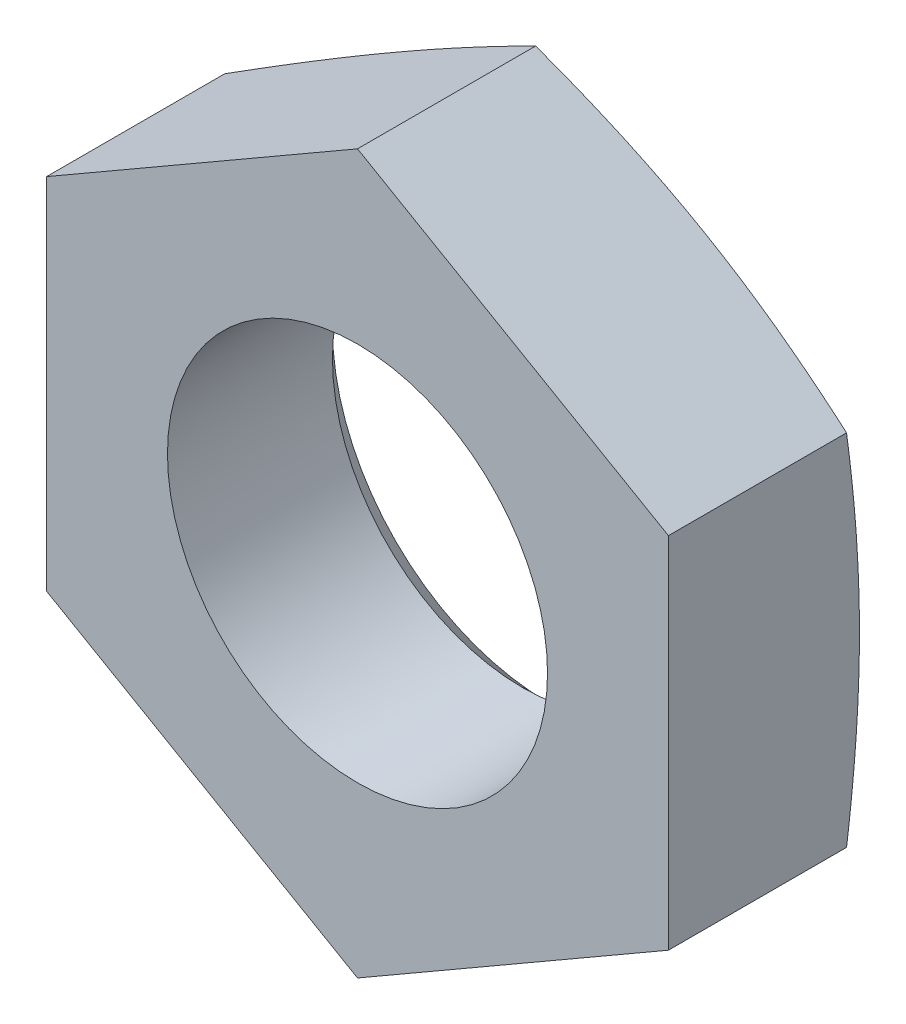
ISO-10303-21;
HEADER;
FILE_DESCRIPTION(('STEP AP214'),'2;1');
FILE_NAME('part.step','',(''),(''),'','','');
FILE_SCHEMA(('AUTOMOTIVE_DESIGN { 1 0 10303 214 1 1 1 1 }'));
ENDSEC;
DATA;
#1=APPLICATION_CONTEXT('core data for automotive mechanical design processes');
#2=APPLICATION_PROTOCOL_DEFINITION('international standard','automotive_design',2000,#1);
#3=PRODUCT_CONTEXT('',#1,'mechanical');
#4=PRODUCT('Part','Part','',(#3));
#5=PRODUCT_RELATED_PRODUCT_CATEGORY('part','',(#4));
#6=PRODUCT_DEFINITION_FORMATION('','',#4);
#7=PRODUCT_DEFINITION_CONTEXT('part definition',#1,'design');
#8=PRODUCT_DEFINITION('design','',#6,#7);
#9=PRODUCT_DEFINITION_SHAPE('','',#8);
#10=(LENGTH_UNIT() NAMED_UNIT(*) SI_UNIT(.MILLI.,.METRE.));
#11=(NAMED_UNIT(*) PLANE_ANGLE_UNIT() SI_UNIT($,.RADIAN.));
#12=(NAMED_UNIT(*) SI_UNIT($,.STERADIAN.) SOLID_ANGLE_UNIT());
#13=UNCERTAINTY_MEASURE_WITH_UNIT(LENGTH_MEASURE(1.E-05),#10,'distance_accuracy_value','');
#14=(GEOMETRIC_REPRESENTATION_CONTEXT(3) GLOBAL_UNCERTAINTY_ASSIGNED_CONTEXT((#13)) GLOBAL_UNIT_ASSIGNED_CONTEXT((#10,
#11,#12)) REPRESENTATION_CONTEXT('',''));
#15=CARTESIAN_POINT('',(0.,0.,0.));
#16=DIRECTION('',(0.,0.,1.));
#17=DIRECTION('',(1.,0.,0.));
#18=AXIS2_PLACEMENT_3D('',#15,#16,#17);
#19=CARTESIAN_POINT('',(7.084,7.,0.));
#20=DIRECTION('',(0.,0.,-1.));
#21=DIRECTION('',(0.,1.,0.));
#22=AXIS2_PLACEMENT_3D('',#19,#20,#21);
#23=PLANE('',#22);
#24=CARTESIAN_POINT('',(0.,0.,0.));
#25=DIRECTION('',(0.,0.,1.));
#26=DIRECTION('',(1.,0.,0.));
#27=AXIS2_PLACEMENT_3D('',#24,#25,#26);
#28=CIRCLE('',#27,7.00000000000497);
#29=CARTESIAN_POINT('',(-3.50000000000122,-6.06217782649318,-6.76896280777531E-13));
#30=VERTEX_POINT('',#29);
#31=CARTESIAN_POINT('',(3.50000000000125,-6.06217782649319,-6.78176082030694E-13));
#32=VERTEX_POINT('',#31);
#33=EDGE_CURVE('E91',#30,#32,#28,.T.);
#34=ORIENTED_EDGE('',*,*,#33,.F.);
#35=CARTESIAN_POINT('',(0.,0.,0.));
#36=DIRECTION('',(0.,0.,1.));
#37=DIRECTION('',(1.,0.,0.));
#38=AXIS2_PLACEMENT_3D('',#35,#36,#37);
#39=CIRCLE('',#38,7.00000000000497);
#40=CARTESIAN_POINT('',(-7.00000000000247,0.,-1.42106649798218E-11));
#41=VERTEX_POINT('',#40);
#42=EDGE_CURVE('E85',#41,#30,#39,.T.);
#43=ORIENTED_EDGE('',*,*,#42,.F.);
#44=CARTESIAN_POINT('',(0.,0.,-2.8421275749535E-11));
#45=DIRECTION('',(0.,0.,1.));
#46=DIRECTION('',(1.,0.,0.));
#47=AXIS2_PLACEMENT_3D('',#44,#45,#46);
#48=CIRCLE('',#47,6.99999999994813);
#49=CARTESIAN_POINT('',(-3.49999999998703,6.06217782646863,-1.319034942035E-11));
#50=VERTEX_POINT('',#49);
#51=EDGE_CURVE('E88',#50,#41,#48,.T.);
#52=ORIENTED_EDGE('',*,*,#51,.F.);
#53=CARTESIAN_POINT('',(0.,0.,2.04057690883497E-12));
#54=DIRECTION('',(0.,0.,1.));
#55=DIRECTION('',(1.,0.,0.));
#56=AXIS2_PLACEMENT_3D('',#53,#54,#55);
#57=CIRCLE('',#56,7.00000000006182);
#58=CARTESIAN_POINT('',(3.50000000001548,6.06217782651788,-6.23222509731635E-12));
#59=VERTEX_POINT('',#58);
#60=EDGE_CURVE('E106',#59,#50,#57,.T.);
#61=ORIENTED_EDGE('',*,*,#60,.F.);
#62=CARTESIAN_POINT('',(0.,0.,0.));
#63=DIRECTION('',(0.,0.,1.));
#64=DIRECTION('',(1.,0.,0.));
#65=AXIS2_PLACEMENT_3D('',#62,#63,#64);
#66=CIRCLE('',#65,7.00000000000497);
#67=CARTESIAN_POINT('',(7.00000000000253,0.,-6.63822162753343E-13));
#68=VERTEX_POINT('',#67);
#69=EDGE_CURVE('E294',#68,#59,#66,.T.);
#70=ORIENTED_EDGE('',*,*,#69,.F.);
#71=CARTESIAN_POINT('',(0.,0.,0.));
#72=DIRECTION('',(0.,0.,1.));
#73=DIRECTION('',(1.,0.,0.));
#74=AXIS2_PLACEMENT_3D('',#71,#72,#73);
#75=CIRCLE('',#74,7.00000000000498);
#76=EDGE_CURVE('E295',#32,#68,#75,.T.);
#77=ORIENTED_EDGE('',*,*,#76,.F.);
#78=EDGE_LOOP('',(#34,#43,#52,#61,#70,#77));
#79=FACE_BOUND('',#78,.T.);
#80=CARTESIAN_POINT('',(0.,0.,0.));
#81=DIRECTION('',(0.,0.,-1.));
#82=DIRECTION('',(0.,1.,0.));
#83=AXIS2_PLACEMENT_3D('',#80,#81,#82);
#84=CIRCLE('',#83,4.86400000005463);
#85=CARTESIAN_POINT('',(0.,4.86400000005463,0.));
#86=VERTEX_POINT('',#85);
#87=EDGE_CURVE('E20',#86,#86,#84,.F.);
#88=ORIENTED_EDGE('',*,*,#87,.T.);
#89=EDGE_LOOP('',(#88));
#90=FACE_BOUND('',#89,.T.);
#91=ADVANCED_FACE('F17',(#79,#90),#23,.T.);
#92=CARTESIAN_POINT('',(0.,0.,0.));
#93=DIRECTION('',(0.,0.,-1.));
#94=DIRECTION('',(0.,1.,0.));
#95=AXIS2_PLACEMENT_3D('',#92,#93,#94);
#96=CONICAL_SURFACE('',#95,4.86400000005463,0.785398163397448);
#97=ORIENTED_EDGE('',*,*,#87,.F.);
#98=EDGE_LOOP('',(#97));
#99=FACE_BOUND('',#98,.T.);
#100=CARTESIAN_POINT('',(0.,0.,0.585999999999948));
#101=DIRECTION('',(0.,0.,1.));
#102=DIRECTION('',(1.,0.,0.));
#103=AXIS2_PLACEMENT_3D('',#100,#101,#102);
#104=CIRCLE('',#103,4.278);
#105=CARTESIAN_POINT('',(4.27800000000003,0.,0.585999999999948));
#106=VERTEX_POINT('',#105);
#107=EDGE_CURVE('E105',#106,#106,#104,.T.);
#108=ORIENTED_EDGE('',*,*,#107,.T.);
#109=EDGE_LOOP('',(#108));
#110=FACE_BOUND('',#109,.T.);
#111=ADVANCED_FACE('F323',(#99,#110),#96,.F.);
#112=CARTESIAN_POINT('',(0.,0.,0.291904169415602));
#113=DIRECTION('',(0.,0.,1.));
#114=DIRECTION('',(1.,0.,0.));
#115=AXIS2_PLACEMENT_3D('',#112,#113,#114);
#116=CONICAL_SURFACE('',#115,8.08940119128462,1.30899693901397);
#117=ORIENTED_EDGE('',*,*,#42,.T.);
#118=CARTESIAN_POINT('',(-6.99999999999925,-4.04145188432135,0.290163190273905));
#119=CARTESIAN_POINT('',(-6.70986023602482,-4.20896415515875,0.24525752563378));
#120=CARTESIAN_POINT('',(-6.41918384251533,-4.37678624920017,0.204486802287307));
#121=CARTESIAN_POINT('',(-5.83725542971782,-4.71276277497907,0.132888648694165));
#122=CARTESIAN_POINT('',(-5.54600444171958,-4.88091661130112,0.102049957460541));
#123=CARTESIAN_POINT('',(-5.10853316460415,-5.13349077090628,0.0644187600860657));
#124=CARTESIAN_POINT('',(-4.96258995261945,-5.21775112363209,0.0533118905781642));
#125=CARTESIAN_POINT('',(-4.67055324940358,-5.38635859284705,0.0341360076685796));
#126=CARTESIAN_POINT('',(-4.52445975870355,-5.47070570902955,0.0260669835668494));
#127=CARTESIAN_POINT('',(-4.2320017165008,-5.63955643842197,0.0130936275290932));
#128=CARTESIAN_POINT('',(-4.0856370451716,-5.72406012081374,0.00819287797152043));
#129=CARTESIAN_POINT('',(-3.79284864328292,-5.89310158345978,0.00164120011324006));
#130=CARTESIAN_POINT('',(-3.6464249109748,-5.97763936472361,-9.62362470803385E-06));
#131=CARTESIAN_POINT('',(-3.49999999999995,-6.06217782649099,-1.35376441792632E-12));
#132=B_SPLINE_CURVE_WITH_KNOTS('',3,(#118,#119,#120,#121,#122,#123,#124,#125,#126,#127,#128,
#129,#130,#131),.UNSPECIFIED.,.F.,.F.,(4,2,2,2,2,2,4),(0.,1.01414051803007,2.02712711718516,
2.53376123183741,3.0403935619816,3.54759774566711,4.05481824781813),.UNSPECIFIED.);
#133=CARTESIAN_POINT('',(-7.00000000000125,-4.04145188432805,0.29016319026956));
#134=VERTEX_POINT('',#133);
#135=EDGE_CURVE('E111',#134,#30,#132,.T.);
#136=ORIENTED_EDGE('',*,*,#135,.F.);
#137=CARTESIAN_POINT('',(-7.,0.,-1.32923867054119E-12));
#138=CARTESIAN_POINT('',(-7.,-0.169076923534791,-9.62362468090186E-06));
#139=CARTESIAN_POINT('',(-7.,-0.338152486062438,0.00164120011326512));
#140=CARTESIAN_POINT('',(-7.,-0.676235411354457,0.00819287797154053));
#141=CARTESIAN_POINT('',(-7.,-0.845242776137971,0.0130936275291105));
#142=CARTESIAN_POINT('',(-7.,-1.18294423492279,0.0260669835668693));
#143=CARTESIAN_POINT('',(-7.,-1.3516384672878,0.0341360076686051));
#144=CARTESIAN_POINT('',(-7.,-1.68885340571766,0.0533118905781666));
#145=CARTESIAN_POINT('',(-7.,-1.85737411116921,0.0644187600860394));
#146=CARTESIAN_POINT('',(-7.,-2.36252243037968,0.102049957460616));
#147=CARTESIAN_POINT('',(-7.,-2.69883010302441,0.132888648694557));
#148=CARTESIAN_POINT('',(-7.,-3.37078315458043,0.204486802286878));
#149=CARTESIAN_POINT('',(-7.,-3.70642734266086,0.24525752563221));
#150=CARTESIAN_POINT('',(-7.,-4.0414518843297,0.290163190269488));
#151=B_SPLINE_CURVE_WITH_KNOTS('',3,(#137,#138,#139,#140,#141,#142,#143,#144,#145,#146,#147,
#148,#149,#150),.UNSPECIFIED.,.F.,.F.,(4,2,2,2,2,2,4),(0.,0.507220502150942,1.0144246858364,
1.52105701598055,2.02769113063276,3.04067772978769,4.05481824781752),.UNSPECIFIED.);
#152=EDGE_CURVE('E108',#41,#134,#151,.T.);
#153=ORIENTED_EDGE('',*,*,#152,.F.);
#154=EDGE_LOOP('',(#117,#136,#153));
#155=FACE_BOUND('',#154,.T.);
#156=ADVANCED_FACE('F109',(#155),#116,.T.);
#157=CARTESIAN_POINT('',(0.,0.,0.291904169415602));
#158=DIRECTION('',(0.,0.,1.));
#159=DIRECTION('',(1.,0.,0.));
#160=AXIS2_PLACEMENT_3D('',#157,#158,#159);
#161=CONICAL_SURFACE('',#160,8.08940119128462,1.30899693901397);
#162=CARTESIAN_POINT('',(-4.82260511685675E-12,-8.08290376865109,0.290163190273904));
#163=CARTESIAN_POINT('',(0.290139763973197,-7.91539149781991,0.245257525633773));
#164=CARTESIAN_POINT('',(0.580816157484114,-7.74756940378096,0.204486802287298));
#165=CARTESIAN_POINT('',(1.16274457028263,-7.41159287800381,0.132888648694156));
#166=CARTESIAN_POINT('',(1.45399555828047,-7.24343904168104,0.102049957460532));
#167=CARTESIAN_POINT('',(1.89146683539575,-6.99086488207564,0.0644187600860573));
#168=CARTESIAN_POINT('',(2.03741004738049,-6.90660452934989,0.0533118905781559));
#169=CARTESIAN_POINT('',(2.32944675059638,-6.73799706013497,0.0341360076685715));
#170=CARTESIAN_POINT('',(2.4755402412964,-6.65364994395245,0.0260669835668414));
#171=CARTESIAN_POINT('',(2.76799828349915,-6.48479921456002,0.0130936275290853));
#172=CARTESIAN_POINT('',(2.91436295482835,-6.40029553216825,0.00819287797151239));
#173=CARTESIAN_POINT('',(3.20715135671704,-6.23125406952222,0.00164120011323326));
#174=CARTESIAN_POINT('',(3.35357508902515,-6.14671628825839,-9.62362471351317E-06));
#175=CARTESIAN_POINT('',(3.5,-6.062177826491,-1.35641319560552E-12));
#176=B_SPLINE_CURVE_WITH_KNOTS('',3,(#162,#163,#164,#165,#166,#167,#168,#169,#170,#171,#172,
#173,#174,#175),.UNSPECIFIED.,.F.,.F.,(4,2,2,2,2,2,4),(0.,1.01414051803007,2.02712711718517,
2.53376123183741,3.0403935619816,3.54759774566712,4.05481824781814),.UNSPECIFIED.);
#177=CARTESIAN_POINT('',(0.,-8.08290376865615,0.290163190269547));
#178=VERTEX_POINT('',#177);
#179=EDGE_CURVE('E230',#178,#32,#176,.T.);
#180=ORIENTED_EDGE('',*,*,#179,.F.);
#181=CARTESIAN_POINT('',(-3.49999999999995,-6.06217782649099,-1.35351583800864E-12));
#182=CARTESIAN_POINT('',(-3.35357508902513,-6.14671628825838,-9.62362470519207E-06));
#183=CARTESIAN_POINT('',(-3.20715135671704,-6.23125406952221,0.00164120011324078));
#184=CARTESIAN_POINT('',(-2.9143629548284,-6.40029553216823,0.00819287797151603));
#185=CARTESIAN_POINT('',(-2.76799828349921,-6.48479921455999,0.0130936275290859));
#186=CARTESIAN_POINT('',(-2.47554024129648,-6.6536499439524,0.0260669835668444));
#187=CARTESIAN_POINT('',(-2.32944675059647,-6.7379970601349,0.03413600766858));
#188=CARTESIAN_POINT('',(-2.0374100473806,-6.90660452934984,0.0533118905781416));
#189=CARTESIAN_POINT('',(-1.89146683539588,-6.99086488207561,0.0644187600860147));
#190=CARTESIAN_POINT('',(-1.4539955582806,-7.24343904168085,0.102049957460592));
#191=CARTESIAN_POINT('',(-1.16274457028264,-7.41159287800322,0.132888648694533));
#192=CARTESIAN_POINT('',(-0.580816157484646,-7.74756940378123,0.204486802286856));
#193=CARTESIAN_POINT('',(-0.290139763974385,-7.91539149782144,0.245257525632189));
#194=CARTESIAN_POINT('',(2.07905872180506E-12,-8.08290376865586,0.290163190269467));
#195=B_SPLINE_CURVE_WITH_KNOTS('',3,(#181,#182,#183,#184,#185,#186,#187,#188,#189,#190,#191,
#192,#193,#194),.UNSPECIFIED.,.F.,.F.,(4,2,2,2,2,2,4),(0.,0.507220502150949,1.01442468583641,
1.52105701598058,2.02769113063279,3.04067772978773,4.05481824781758),.UNSPECIFIED.);
#196=EDGE_CURVE('E240',#30,#178,#195,.T.);
#197=ORIENTED_EDGE('',*,*,#196,.F.);
#198=ORIENTED_EDGE('',*,*,#33,.T.);
#199=EDGE_LOOP('',(#180,#197,#198));
#200=FACE_BOUND('',#199,.T.);
#201=ADVANCED_FACE('F207',(#200),#161,.T.);
#202=CARTESIAN_POINT('',(0.,0.,0.291904169444024));
#203=DIRECTION('',(0.,0.,1.));
#204=DIRECTION('',(1.,0.,0.));
#205=AXIS2_PLACEMENT_3D('',#202,#203,#204);
#206=CONICAL_SURFACE('',#205,8.08940119128462,1.30899693898963);
#207=CARTESIAN_POINT('',(7.,-4.04145188432655,0.29016319029732));
#208=CARTESIAN_POINT('',(7.,-3.70642734265831,0.245257525655767));
#209=CARTESIAN_POINT('',(7.,-3.37078315457835,0.204486802306538));
#210=CARTESIAN_POINT('',(7.,-2.69883010302317,0.132888648707365));
#211=CARTESIAN_POINT('',(7.,-2.36252243037878,0.102049957470464));
#212=CARTESIAN_POINT('',(7.,-1.8573741111687,0.0644187600922639));
#213=CARTESIAN_POINT('',(7.,-1.68885340571726,0.0533118905833188));
#214=CARTESIAN_POINT('',(7.,-1.35163846728758,0.034136007671904));
#215=CARTESIAN_POINT('',(7.,-1.18294423492264,0.0260669835693873));
#216=CARTESIAN_POINT('',(7.,-0.845242776137902,0.0130936275303688));
#217=CARTESIAN_POINT('',(7.,-0.676235411354399,0.00819287797232097));
#218=CARTESIAN_POINT('',(7.,-0.338152486062389,0.00164120011341128));
#219=CARTESIAN_POINT('',(7.,-0.169076923534739,-9.62362469117186E-06));
#220=CARTESIAN_POINT('',(7.,0.,-1.32763708478982E-12));
#221=B_SPLINE_CURVE_WITH_KNOTS('',3,(#207,#208,#209,#210,#211,#212,#213,#214,#215,#216,#217,
#218,#219,#220),.UNSPECIFIED.,.F.,.F.,(4,2,2,2,2,2,4),(0.,1.01414051802979,2.02712711718444,
2.53376123183655,3.0403935619806,3.54759774566605,4.054818247817),.UNSPECIFIED.);
#222=CARTESIAN_POINT('',(6.9999999999997,-4.04145188432711,0.290163190297314));
#223=VERTEX_POINT('',#222);
#224=EDGE_CURVE('E218',#223,#68,#221,.T.);
#225=ORIENTED_EDGE('',*,*,#224,.F.);
#226=CARTESIAN_POINT('',(3.5,-6.062177826491,-1.35652073199957E-12));
#227=CARTESIAN_POINT('',(3.64642491097483,-5.97763936472361,-9.623624711333E-06));
#228=CARTESIAN_POINT('',(3.79284864328291,-5.89310158345978,0.00164120011339484));
#229=CARTESIAN_POINT('',(4.08563704517156,-5.72406012081377,0.0081928779723077));
#230=CARTESIAN_POINT('',(4.23200171650073,-5.63955643842202,0.013093627530355));
#231=CARTESIAN_POINT('',(4.52445975870339,-5.47070570902965,0.0260669835693737));
#232=CARTESIAN_POINT('',(4.67055324940334,-5.38635859284718,0.0341360076718913));
#233=CARTESIAN_POINT('',(4.96258995261906,-5.21775112363233,0.0533118905833074));
#234=CARTESIAN_POINT('',(5.10853316460368,-5.13349077090661,0.0644187600922529));
#235=CARTESIAN_POINT('',(5.54600444171863,-4.88091661130157,0.102049957470455));
#236=CARTESIAN_POINT('',(5.83725542971629,-4.71276277497937,0.132888648707358));
#237=CARTESIAN_POINT('',(6.41918384251356,-4.37678624920177,0.204486802306533));
#238=CARTESIAN_POINT('',(6.70986023602341,-4.20896415516179,0.24525752565576));
#239=CARTESIAN_POINT('',(6.99999999999935,-4.04145188432766,0.290163190297308));
#240=B_SPLINE_CURVE_WITH_KNOTS('',3,(#226,#227,#228,#229,#230,#231,#232,#233,#234,#235,#236,
#237,#238,#239),.UNSPECIFIED.,.F.,.F.,(4,2,2,2,2,2,4),(0.,0.507220502150955,1.01442468583642,
1.52105701598048,2.02769113063259,3.04067772978726,4.05481824781706),.UNSPECIFIED.);
#241=EDGE_CURVE('E212',#32,#223,#240,.T.);
#242=ORIENTED_EDGE('',*,*,#241,.F.);
#243=ORIENTED_EDGE('',*,*,#76,.T.);
#244=EDGE_LOOP('',(#225,#242,#243));
#245=FACE_BOUND('',#244,.T.);
#246=ADVANCED_FACE('F201',(#245),#206,.T.);
#247=CARTESIAN_POINT('',(0.,0.,0.291904169415602));
#248=DIRECTION('',(0.,0.,1.));
#249=DIRECTION('',(1.,0.,0.));
#250=AXIS2_PLACEMENT_3D('',#247,#248,#249);
#251=CONICAL_SURFACE('',#250,8.08940119128462,1.30899693901397);
#252=CARTESIAN_POINT('',(6.99999999999934,4.04145188432146,0.29016319027396));
#253=CARTESIAN_POINT('',(6.70986023602491,4.20896415515887,0.245257525633816));
#254=CARTESIAN_POINT('',(6.41918384251542,4.37678624920029,0.204486802287336));
#255=CARTESIAN_POINT('',(5.83725542971791,4.7127627749792,0.132888648694191));
#256=CARTESIAN_POINT('',(5.54600444171965,4.88091661130126,0.10204995746057));
#257=CARTESIAN_POINT('',(5.10853316460423,5.13349077090642,0.0644187600860956));
#258=CARTESIAN_POINT('',(4.96258995261952,5.21775112363223,0.0533118905781941));
#259=CARTESIAN_POINT('',(4.67055324940365,5.38635859284719,0.0341360076686101));
#260=CARTESIAN_POINT('',(4.52445975870362,5.4707057090297,0.0260669835668806));
#261=CARTESIAN_POINT('',(4.23200171650087,5.63955643842212,0.0130936275291252));
#262=CARTESIAN_POINT('',(4.08563704517166,5.72406012081389,0.00819287797155247));
#263=CARTESIAN_POINT('',(3.79284864328297,5.89310158345992,0.0016412001132739));
#264=CARTESIAN_POINT('',(3.64642491097486,5.97763936472376,-9.62362467247825E-06));
#265=CARTESIAN_POINT('',(3.5,6.06217782649114,-1.31458236345017E-12));
#266=B_SPLINE_CURVE_WITH_KNOTS('',3,(#252,#253,#254,#255,#256,#257,#258,#259,#260,#261,#262,
#263,#264,#265),.UNSPECIFIED.,.F.,.F.,(4,2,2,2,2,2,4),(0.,1.01414051803008,2.02712711718519,
2.53376123183744,3.04039356198164,3.54759774566716,4.05481824781819),.UNSPECIFIED.);
#267=CARTESIAN_POINT('',(7.00000000000133,4.04145188432818,0.290163190269584));
#268=VERTEX_POINT('',#267);
#269=EDGE_CURVE('E183',#268,#59,#266,.T.);
#270=ORIENTED_EDGE('',*,*,#269,.F.);
#271=CARTESIAN_POINT('',(7.,0.,-1.32759011539806E-12));
#272=CARTESIAN_POINT('',(7.,0.169076923534796,-9.62362468992953E-06));
#273=CARTESIAN_POINT('',(7.,0.338152486062448,0.00164120011325185));
#274=CARTESIAN_POINT('',(7.,0.676235411354476,0.00819287797152451));
#275=CARTESIAN_POINT('',(7.,0.845242776137995,0.013093627529096));
#276=CARTESIAN_POINT('',(7.,1.18294423492282,0.0260669835668564));
#277=CARTESIAN_POINT('',(7.,1.35163846728784,0.0341360076685923));
#278=CARTESIAN_POINT('',(7.,1.68885340571771,0.0533118905781548));
#279=CARTESIAN_POINT('',(7.,1.85737411116926,0.0644187600860285));
#280=CARTESIAN_POINT('',(7.,2.36252243037975,0.102049957460607));
#281=CARTESIAN_POINT('',(7.,2.69883010302449,0.132888648694548));
#282=CARTESIAN_POINT('',(7.,3.37078315458051,0.204486802286876));
#283=CARTESIAN_POINT('',(7.,3.70642734266096,0.245257525632214));
#284=CARTESIAN_POINT('',(7.,4.0414518843298,0.290163190269503));
#285=B_SPLINE_CURVE_WITH_KNOTS('',3,(#271,#272,#273,#274,#275,#276,#277,#278,#279,#280,#281,
#282,#283,#284),.UNSPECIFIED.,.F.,.F.,(4,2,2,2,2,2,4),(0.,0.507220502150955,1.01442468583642,
1.52105701598059,2.02769113063282,3.04067772978777,4.05481824781763),.UNSPECIFIED.);
#286=EDGE_CURVE('E191',#68,#268,#285,.T.);
#287=ORIENTED_EDGE('',*,*,#286,.F.);
#288=ORIENTED_EDGE('',*,*,#69,.T.);
#289=EDGE_LOOP('',(#270,#287,#288));
#290=FACE_BOUND('',#289,.T.);
#291=ADVANCED_FACE('F197',(#290),#251,.T.);
#292=CARTESIAN_POINT('',(0.,0.,0.291904169444024));
#293=DIRECTION('',(0.,0.,1.));
#294=DIRECTION('',(1.,0.,0.));
#295=AXIS2_PLACEMENT_3D('',#292,#293,#294);
#296=CONICAL_SURFACE('',#295,8.08940119134147,1.30899693899138);
#297=ORIENTED_EDGE('',*,*,#60,.T.);
#298=CARTESIAN_POINT('',(1.1166451025008E-12,8.08290376865545,0.290163190282392));
#299=CARTESIAN_POINT('',(-0.290139763974996,7.91539149782123,0.245257525641116));
#300=CARTESIAN_POINT('',(-0.580816157485003,7.74756940378116,0.204486802292135));
#301=CARTESIAN_POINT('',(-1.16274457028259,7.41159287800338,0.132888648693394));
#302=CARTESIAN_POINT('',(-1.4539955582804,7.2434390416811,0.102049957456678));
#303=CARTESIAN_POINT('',(-1.89146683539557,6.99086488207593,0.0644187600787046));
#304=CARTESIAN_POINT('',(-2.03741004738026,6.90660452935016,0.0533118905698266));
#305=CARTESIAN_POINT('',(-2.32944675059612,6.73799706013524,0.0341360076585273));
#306=CARTESIAN_POINT('',(-2.47554024129615,6.65364994395273,0.0260669835560591));
#307=CARTESIAN_POINT('',(-2.76799828349893,6.48479921456028,0.0130936275171195));
#308=CARTESIAN_POINT('',(-2.91436295482818,6.40029553216849,0.00819287795910209));
#309=CARTESIAN_POINT('',(-3.20715135671695,6.2312540695224,0.00164120010022971));
#310=CARTESIAN_POINT('',(-3.35357508902511,6.14671628825853,-9.62363786583339E-06));
#311=CARTESIAN_POINT('',(-3.5,6.0621778264911,-1.45097752951811E-11));
#312=B_SPLINE_CURVE_WITH_KNOTS('',3,(#298,#299,#300,#301,#302,#303,#304,#305,#306,#307,#308,
#309,#310,#311),.UNSPECIFIED.,.F.,.F.,(4,2,2,2,2,2,4),(0.,1.01414051803026,2.02712711718541,
2.53376123183776,3.04039356198205,3.54759774566774,4.05481824781893),.UNSPECIFIED.);
#313=CARTESIAN_POINT('',(0.,8.08290376865545,0.290163190282392));
#314=VERTEX_POINT('',#313);
#315=EDGE_CURVE('E155',#314,#50,#312,.T.);
#316=ORIENTED_EDGE('',*,*,#315,.F.);
#317=CARTESIAN_POINT('',(3.4999999999997,6.06217782649055,-1.39756361690007E-11));
#318=CARTESIAN_POINT('',(3.35357508902502,6.14671628825835,-9.62363767138449E-06));
#319=CARTESIAN_POINT('',(3.20715135671695,6.23125406952238,0.00164120010028488));
#320=CARTESIAN_POINT('',(2.91436295482824,6.40029553216857,0.00819287795905549));
#321=CARTESIAN_POINT('',(2.76799828349897,6.48479921456032,0.0130936275171104));
#322=CARTESIAN_POINT('',(2.47554024129617,6.65364994395274,0.0260669835560776));
#323=CARTESIAN_POINT('',(2.32944675059615,6.73799706013526,0.034136007658536));
#324=CARTESIAN_POINT('',(2.03741004738031,6.90660452935019,0.0533118905698279));
#325=CARTESIAN_POINT('',(1.89146683539561,6.99086488207595,0.0644187600787084));
#326=CARTESIAN_POINT('',(1.45399555828045,7.24343904168111,0.102049957456685));
#327=CARTESIAN_POINT('',(1.16274457028265,7.41159287800339,0.132888648693399));
#328=CARTESIAN_POINT('',(0.580816157485081,7.74756940378116,0.204486802292134));
#329=CARTESIAN_POINT('',(0.290139763975083,7.91539149782123,0.245257525641113));
#330=CARTESIAN_POINT('',(-1.02306775481225E-12,8.08290376865545,0.290163190282391));
#331=B_SPLINE_CURVE_WITH_KNOTS('',3,(#317,#318,#319,#320,#321,#322,#323,#324,#325,#326,#327,
#328,#329,#330),.UNSPECIFIED.,.F.,.F.,(4,2,2,2,2,2,4),(0.,0.507220502151185,1.01442468583687,
1.52105701598116,2.0276911306335,3.04067772978861,4.05481824781885),.UNSPECIFIED.);
#332=EDGE_CURVE('E177',#59,#314,#331,.T.);
#333=ORIENTED_EDGE('',*,*,#332,.F.);
#334=EDGE_LOOP('',(#297,#316,#333));
#335=FACE_BOUND('',#334,.T.);
#336=ADVANCED_FACE('F142',(#335),#296,.T.);
#337=CARTESIAN_POINT('',(0.,0.,0.291904169444024));
#338=DIRECTION('',(0.,0.,1.));
#339=DIRECTION('',(1.,0.,0.));
#340=AXIS2_PLACEMENT_3D('',#337,#338,#339);
#341=CONICAL_SURFACE('',#340,8.08940119134147,1.30899693899138);
#342=ORIENTED_EDGE('',*,*,#51,.T.);
#343=CARTESIAN_POINT('',(-7.,4.0414518843286,0.290163190282374));
#344=CARTESIAN_POINT('',(-7.,3.70642734266016,0.245257525641101));
#345=CARTESIAN_POINT('',(-7.,3.37078315458002,0.204486802292122));
#346=CARTESIAN_POINT('',(-7.,2.69883010302447,0.132888648693383));
#347=CARTESIAN_POINT('',(-7.,2.36252243037992,0.102049957456668));
#348=CARTESIAN_POINT('',(-7.,1.85737411116958,0.0644187600786951));
#349=CARTESIAN_POINT('',(-7.,1.68885340571806,0.0533118905698173));
#350=CARTESIAN_POINT('',(-7.,1.35163846728821,0.0341360076585185));
#351=CARTESIAN_POINT('',(-7.,1.18294423492319,0.0260669835560504));
#352=CARTESIAN_POINT('',(-7.,0.845242776138289,0.0130936275171116));
#353=CARTESIAN_POINT('',(-7.,0.676235411354708,0.00819287795909465));
#354=CARTESIAN_POINT('',(-7.,0.338152486062543,0.00164120010022215));
#355=CARTESIAN_POINT('',(-7.,0.169076923534817,-9.62363787400228E-06));
#356=CARTESIAN_POINT('',(-7.,0.,-1.45198158449045E-11));
#357=B_SPLINE_CURVE_WITH_KNOTS('',3,(#343,#344,#345,#346,#347,#348,#349,#350,#351,#352,#353,
#354,#355,#356),.UNSPECIFIED.,.F.,.F.,(4,2,2,2,2,2,4),(0.,1.01414051803025,2.02712711718539,
2.53376123183773,3.04039356198202,3.5475977456677,4.05481824781888),.UNSPECIFIED.);
#358=CARTESIAN_POINT('',(-7.,4.041451884328,0.290163190282299));
#359=VERTEX_POINT('',#358);
#360=EDGE_CURVE('E100',#359,#41,#357,.T.);
#361=ORIENTED_EDGE('',*,*,#360,.F.);
#362=CARTESIAN_POINT('',(-3.5,6.0621778264911,-1.45096680904847E-11));
#363=CARTESIAN_POINT('',(-3.6464249109749,5.97763936472368,-9.62363786549007E-06));
#364=CARTESIAN_POINT('',(-3.79284864328306,5.89310158345982,0.00164120010023006));
#365=CARTESIAN_POINT('',(-4.08563704517183,5.72406012081374,0.00819287795910231));
#366=CARTESIAN_POINT('',(-4.23200171650108,5.63955643842195,0.0130936275171196));
#367=CARTESIAN_POINT('',(-4.52445975870386,5.4707057090295,0.0260669835560592));
#368=CARTESIAN_POINT('',(-4.67055324940389,5.38635859284699,0.0341360076585275));
#369=CARTESIAN_POINT('',(-4.96258995261974,5.21775112363207,0.053311890569827));
#370=CARTESIAN_POINT('',(-5.10853316460444,5.1334907709063,0.064418760078705));
#371=CARTESIAN_POINT('',(-5.5460044417196,4.88091661130113,0.102049957456678));
#372=CARTESIAN_POINT('',(-5.83725542971741,4.71276277497885,0.132888648693394));
#373=CARTESIAN_POINT('',(-6.419183842515,4.37678624920107,0.204486802292134));
#374=CARTESIAN_POINT('',(-6.709860236025,4.208964155161,0.245257525641114));
#375=CARTESIAN_POINT('',(-7.00000000000111,4.04145188432678,0.29016319028239));
#376=B_SPLINE_CURVE_WITH_KNOTS('',3,(#362,#363,#364,#365,#366,#367,#368,#369,#370,#371,#372,
#373,#374,#375),.UNSPECIFIED.,.F.,.F.,(4,2,2,2,2,2,4),(0.,0.507220502151182,1.01442468583687,
1.52105701598117,2.02769113063351,3.04067772978865,4.05481824781891),.UNSPECIFIED.);
#377=EDGE_CURVE('E103',#50,#359,#376,.T.);
#378=ORIENTED_EDGE('',*,*,#377,.F.);
#379=EDGE_LOOP('',(#342,#361,#378));
#380=FACE_BOUND('',#379,.T.);
#381=ADVANCED_FACE('F98',(#380),#341,.T.);
#382=CARTESIAN_POINT('',(0.,0.,0.585999999999948));
#383=DIRECTION('',(0.,0.,1.));
#384=DIRECTION('',(1.,0.,0.));
#385=AXIS2_PLACEMENT_3D('',#382,#383,#384);
#386=CYLINDRICAL_SURFACE('',#385,4.278);
#387=CARTESIAN_POINT('',(0.,0.,4.29999999999995));
#388=DIRECTION('',(0.,0.,1.));
#389=DIRECTION('',(1.,0.,0.));
#390=AXIS2_PLACEMENT_3D('',#387,#388,#389);
#391=CIRCLE('',#390,4.278);
#392=CARTESIAN_POINT('',(4.27800000000003,0.,4.29999999999995));
#393=VERTEX_POINT('',#392);
#394=EDGE_CURVE('E154',#393,#393,#391,.F.);
#395=ORIENTED_EDGE('',*,*,#394,.F.);
#396=EDGE_LOOP('',(#395));
#397=FACE_BOUND('',#396,.T.);
#398=ORIENTED_EDGE('',*,*,#107,.F.);
#399=EDGE_LOOP('',(#398));
#400=FACE_BOUND('',#399,.T.);
#401=ADVANCED_FACE('F141',(#397,#400),#386,.F.);
#402=CARTESIAN_POINT('',(-7.,4.04145188432742,-0.06000000000006));
#403=DIRECTION('',(-1.,0.,0.));
#404=DIRECTION('',(0.,-1.,0.));
#405=AXIS2_PLACEMENT_3D('',#402,#403,#404);
#406=PLANE('',#405);
#407=ORIENTED_EDGE('',*,*,#360,.T.);
#408=ORIENTED_EDGE('',*,*,#152,.T.);
#409=DIRECTION('',(0.,0.,1.));
#410=VECTOR('',#409,1.);
#411=CARTESIAN_POINT('',(-7.,-4.04145188432728,-0.06000000000006));
#412=LINE('',#411,#410);
#413=CARTESIAN_POINT('',(-7.,-4.0414518843273,4.29999999999995));
#414=VERTEX_POINT('',#413);
#415=EDGE_CURVE('E114',#414,#134,#412,.F.);
#416=ORIENTED_EDGE('',*,*,#415,.F.);
#417=DIRECTION('',(0.,1.,0.));
#418=VECTOR('',#417,1.);
#419=CARTESIAN_POINT('',(-7.,0.,4.29999999999995));
#420=LINE('',#419,#418);
#421=CARTESIAN_POINT('',(-7.,4.04145188432735,4.29999999999995));
#422=VERTEX_POINT('',#421);
#423=EDGE_CURVE('E253',#422,#414,#420,.F.);
#424=ORIENTED_EDGE('',*,*,#423,.F.);
#425=DIRECTION('',(0.,0.,1.));
#426=VECTOR('',#425,1.);
#427=CARTESIAN_POINT('',(-7.,4.0414518843274,-0.0600000000000045));
#428=LINE('',#427,#426);
#429=EDGE_CURVE('E118',#359,#422,#428,.T.);
#430=ORIENTED_EDGE('',*,*,#429,.F.);
#431=EDGE_LOOP('',(#407,#408,#416,#424,#430));
#432=FACE_BOUND('',#431,.T.);
#433=ADVANCED_FACE('F116',(#432),#406,.T.);
#434=CARTESIAN_POINT('',(-7.,-4.04145188432729,-0.06000000000006));
#435=DIRECTION('',(-0.5,-0.866025403784439,0.));
#436=DIRECTION('',(0.866025403784439,-0.5,0.));
#437=AXIS2_PLACEMENT_3D('',#434,#435,#436);
#438=PLANE('',#437);
#439=ORIENTED_EDGE('',*,*,#135,.T.);
#440=ORIENTED_EDGE('',*,*,#196,.T.);
#441=DIRECTION('',(0.,0.,1.));
#442=VECTOR('',#441,1.);
#443=CARTESIAN_POINT('',(0.,-8.08290376865472,-0.06000000000006));
#444=LINE('',#443,#442);
#445=CARTESIAN_POINT('',(0.,-8.0829037686547,4.29999999999995));
#446=VERTEX_POINT('',#445);
#447=EDGE_CURVE('E237',#446,#178,#444,.F.);
#448=ORIENTED_EDGE('',*,*,#447,.F.);
#449=DIRECTION('',(0.866025403784433,-0.500000000000009,0.));
#450=VECTOR('',#449,1.);
#451=CARTESIAN_POINT('',(-7.,-4.04145188432728,4.29999999999995));
#452=LINE('',#451,#450);
#453=EDGE_CURVE('E256',#414,#446,#452,.T.);
#454=ORIENTED_EDGE('',*,*,#453,.F.);
#455=ORIENTED_EDGE('',*,*,#415,.T.);
#456=EDGE_LOOP('',(#439,#440,#448,#454,#455));
#457=FACE_BOUND('',#456,.T.);
#458=ADVANCED_FACE('F276',(#457),#438,.T.);
#459=CARTESIAN_POINT('',(0.,-8.08290376865467,-0.06000000000006));
#460=DIRECTION('',(0.5,-0.866025403784438,0.));
#461=DIRECTION('',(0.866025403784438,0.5,0.));
#462=AXIS2_PLACEMENT_3D('',#459,#460,#461);
#463=PLANE('',#462);
#464=ORIENTED_EDGE('',*,*,#179,.T.);
#465=ORIENTED_EDGE('',*,*,#241,.T.);
#466=DIRECTION('',(0.,0.,1.));
#467=VECTOR('',#466,1.);
#468=CARTESIAN_POINT('',(7.,-4.04145188432735,-0.06000000000006));
#469=LINE('',#468,#467);
#470=CARTESIAN_POINT('',(7.,-4.04145188432733,4.29999999999993));
#471=VERTEX_POINT('',#470);
#472=EDGE_CURVE('E224',#471,#223,#469,.F.);
#473=ORIENTED_EDGE('',*,*,#472,.F.);
#474=DIRECTION('',(0.866025403784443,0.499999999999993,0.));
#475=VECTOR('',#474,1.);
#476=CARTESIAN_POINT('',(0.,-8.08290376865472,4.29999999999995));
#477=LINE('',#476,#475);
#478=EDGE_CURVE('E261',#446,#471,#477,.T.);
#479=ORIENTED_EDGE('',*,*,#478,.F.);
#480=ORIENTED_EDGE('',*,*,#447,.T.);
#481=EDGE_LOOP('',(#464,#465,#473,#479,#480));
#482=FACE_BOUND('',#481,.T.);
#483=ADVANCED_FACE('F280',(#482),#463,.T.);
#484=CARTESIAN_POINT('',(7.,-4.04145188432734,-0.06000000000006));
#485=DIRECTION('',(1.,0.,0.));
#486=DIRECTION('',(0.,1.,0.));
#487=AXIS2_PLACEMENT_3D('',#484,#485,#486);
#488=PLANE('',#487);
#489=ORIENTED_EDGE('',*,*,#224,.T.);
#490=ORIENTED_EDGE('',*,*,#286,.T.);
#491=DIRECTION('',(0.,0.,1.));
#492=VECTOR('',#491,1.);
#493=CARTESIAN_POINT('',(7.,4.04145188432746,-0.0600000000000045));
#494=LINE('',#493,#492);
#495=CARTESIAN_POINT('',(7.,4.04145188432743,4.29999999999995));
#496=VERTEX_POINT('',#495);
#497=EDGE_CURVE('E190',#496,#268,#494,.F.);
#498=ORIENTED_EDGE('',*,*,#497,.F.);
#499=DIRECTION('',(0.,1.,0.));
#500=VECTOR('',#499,1.);
#501=CARTESIAN_POINT('',(7.,0.,4.29999999999995));
#502=LINE('',#501,#500);
#503=EDGE_CURVE('E250',#471,#496,#502,.T.);
#504=ORIENTED_EDGE('',*,*,#503,.F.);
#505=ORIENTED_EDGE('',*,*,#472,.T.);
#506=EDGE_LOOP('',(#489,#490,#498,#504,#505));
#507=FACE_BOUND('',#506,.T.);
#508=ADVANCED_FACE('F173',(#507),#488,.T.);
#509=CARTESIAN_POINT('',(7.,4.04145188432747,-0.0600000000000045));
#510=DIRECTION('',(0.5,0.866025403784439,0.));
#511=DIRECTION('',(-0.866025403784439,0.5,0.));
#512=AXIS2_PLACEMENT_3D('',#509,#510,#511);
#513=PLANE('',#512);
#514=ORIENTED_EDGE('',*,*,#269,.T.);
#515=ORIENTED_EDGE('',*,*,#332,.T.);
#516=DIRECTION('',(0.,0.,1.));
#517=VECTOR('',#516,1.);
#518=CARTESIAN_POINT('',(0.,8.08290376865481,-0.0600000000000045));
#519=LINE('',#518,#517);
#520=CARTESIAN_POINT('',(0.,8.08290376865481,4.29999999999995));
#521=VERTEX_POINT('',#520);
#522=EDGE_CURVE('E35',#521,#314,#519,.F.);
#523=ORIENTED_EDGE('',*,*,#522,.F.);
#524=DIRECTION('',(-0.866025403784436,0.5,0.));
#525=VECTOR('',#524,1.);
#526=CARTESIAN_POINT('',(7.,4.04145188432742,4.29999999999995));
#527=LINE('',#526,#525);
#528=EDGE_CURVE('E26',#496,#521,#527,.T.);
#529=ORIENTED_EDGE('',*,*,#528,.F.);
#530=ORIENTED_EDGE('',*,*,#497,.T.);
#531=EDGE_LOOP('',(#514,#515,#523,#529,#530));
#532=FACE_BOUND('',#531,.T.);
#533=ADVANCED_FACE('F167',(#532),#513,.T.);
#534=CARTESIAN_POINT('',(0.,8.08290376865484,-0.0600000000000045));
#535=DIRECTION('',(-0.5,0.866025403784438,0.));
#536=DIRECTION('',(-0.866025403784438,-0.5,0.));
#537=AXIS2_PLACEMENT_3D('',#534,#535,#536);
#538=PLANE('',#537);
#539=ORIENTED_EDGE('',*,*,#315,.T.);
#540=ORIENTED_EDGE('',*,*,#377,.T.);
#541=ORIENTED_EDGE('',*,*,#429,.T.);
#542=DIRECTION('',(-0.866025403784429,-0.500000000000017,0.));
#543=VECTOR('',#542,1.);
#544=CARTESIAN_POINT('',(0.,8.08290376865486,4.29999999999995));
#545=LINE('',#544,#543);
#546=EDGE_CURVE('E11',#521,#422,#545,.T.);
#547=ORIENTED_EDGE('',*,*,#546,.F.);
#548=ORIENTED_EDGE('',*,*,#522,.T.);
#549=EDGE_LOOP('',(#539,#540,#541,#547,#548));
#550=FACE_BOUND('',#549,.T.);
#551=ADVANCED_FACE('F161',(#550),#538,.T.);
#552=CARTESIAN_POINT('',(0.,0.,4.29999999999995));
#553=DIRECTION('',(0.,0.,1.));
#554=DIRECTION('',(1.,0.,0.));
#555=AXIS2_PLACEMENT_3D('',#552,#553,#554);
#556=PLANE('',#555);
#557=ORIENTED_EDGE('',*,*,#528,.T.);
#558=ORIENTED_EDGE('',*,*,#546,.T.);
#559=ORIENTED_EDGE('',*,*,#423,.T.);
#560=ORIENTED_EDGE('',*,*,#453,.T.);
#561=ORIENTED_EDGE('',*,*,#478,.T.);
#562=ORIENTED_EDGE('',*,*,#503,.T.);
#563=EDGE_LOOP('',(#557,#558,#559,#560,#561,#562));
#564=FACE_BOUND('',#563,.T.);
#565=ORIENTED_EDGE('',*,*,#394,.T.);
#566=EDGE_LOOP('',(#565));
#567=FACE_BOUND('',#566,.T.);
#568=ADVANCED_FACE('F166',(#564,#567),#556,.T.);
#569=CLOSED_SHELL('',(#91,#111,#156,#201,#246,#291,#336,#381,#401,#433,#458,#483,#508,#533,#551,#568));
#570=MANIFOLD_SOLID_BREP('B1',#569);
#571=ADVANCED_BREP_SHAPE_REPRESENTATION('',(#18,#570),#14);
#572=SHAPE_DEFINITION_REPRESENTATION(#9,#571);
ENDSEC;
END-ISO-10303-21;
